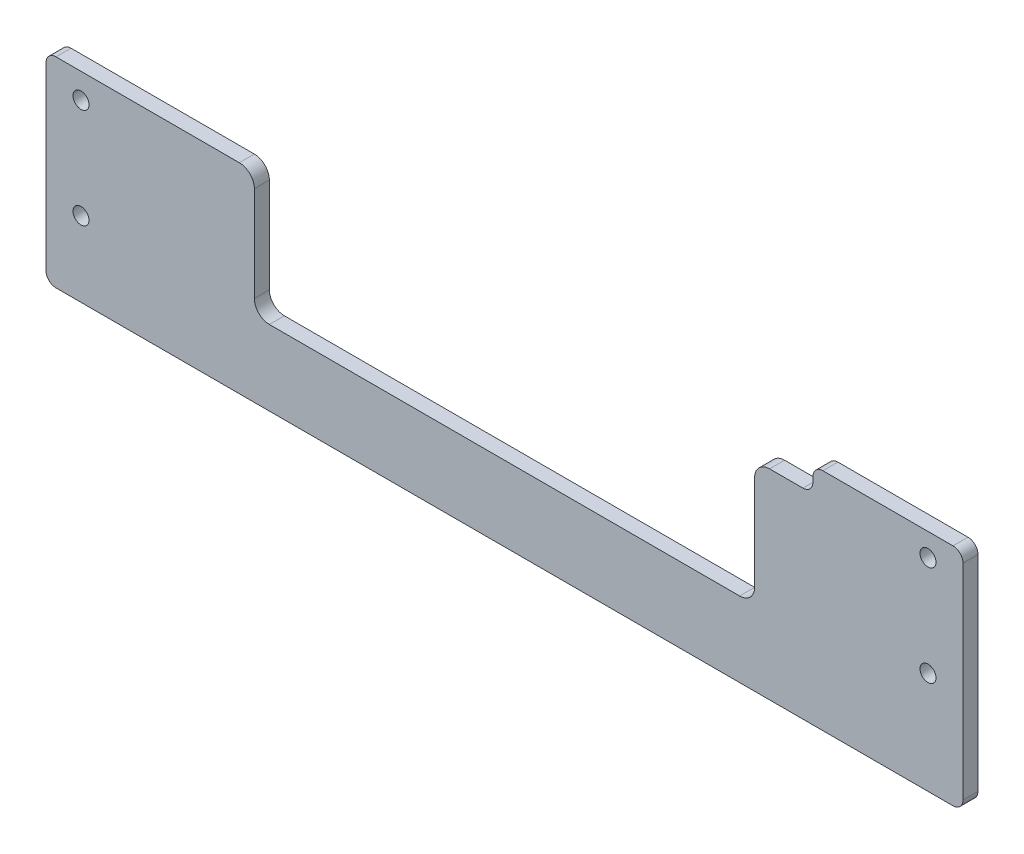
ISO-10303-21;
HEADER;
FILE_DESCRIPTION(('STEP AP214'),'2;1');
FILE_NAME('part.step','',(''),(''),'','','');
FILE_SCHEMA(('AUTOMOTIVE_DESIGN { 1 0 10303 214 1 1 1 1 }'));
ENDSEC;
DATA;
#1=APPLICATION_CONTEXT('core data for automotive mechanical design processes');
#2=APPLICATION_PROTOCOL_DEFINITION('international standard','automotive_design',2000,#1);
#3=PRODUCT_CONTEXT('',#1,'mechanical');
#4=PRODUCT('Part','Part','',(#3));
#5=PRODUCT_RELATED_PRODUCT_CATEGORY('part','',(#4));
#6=PRODUCT_DEFINITION_FORMATION('','',#4);
#7=PRODUCT_DEFINITION_CONTEXT('part definition',#1,'design');
#8=PRODUCT_DEFINITION('design','',#6,#7);
#9=PRODUCT_DEFINITION_SHAPE('','',#8);
#10=(LENGTH_UNIT() NAMED_UNIT(*) SI_UNIT(.MILLI.,.METRE.));
#11=(NAMED_UNIT(*) PLANE_ANGLE_UNIT() SI_UNIT($,.RADIAN.));
#12=(NAMED_UNIT(*) SI_UNIT($,.STERADIAN.) SOLID_ANGLE_UNIT());
#13=UNCERTAINTY_MEASURE_WITH_UNIT(LENGTH_MEASURE(1.E-05),#10,'distance_accuracy_value','');
#14=(GEOMETRIC_REPRESENTATION_CONTEXT(3) GLOBAL_UNCERTAINTY_ASSIGNED_CONTEXT((#13)) GLOBAL_UNIT_ASSIGNED_CONTEXT((#10,
#11,#12)) REPRESENTATION_CONTEXT('',''));
#15=CARTESIAN_POINT('',(0.,0.,0.));
#16=DIRECTION('',(0.,0.,1.));
#17=DIRECTION('',(1.,0.,0.));
#18=AXIS2_PLACEMENT_3D('',#15,#16,#17);
#19=CARTESIAN_POINT('',(0.,40.,3.));
#20=DIRECTION('',(0.,-1.,0.));
#21=DIRECTION('',(1.,0.,0.));
#22=AXIS2_PLACEMENT_3D('',#19,#20,#21);
#23=PLANE('',#22);
#24=DIRECTION('',(-1.,0.,0.));
#25=VECTOR('',#24,1.);
#26=CARTESIAN_POINT('',(0.,40.,0.));
#27=LINE('',#26,#25);
#28=CARTESIAN_POINT('',(151.3,40.,0.));
#29=VERTEX_POINT('',#28);
#30=CARTESIAN_POINT('',(144.65,40.,0.));
#31=VERTEX_POINT('',#30);
#32=EDGE_CURVE('E215',#29,#31,#27,.T.);
#33=ORIENTED_EDGE('',*,*,#32,.T.);
#34=DIRECTION('',(0.,0.,-1.));
#35=VECTOR('',#34,1.);
#36=CARTESIAN_POINT('',(144.65,40.,3.));
#37=LINE('',#36,#35);
#38=CARTESIAN_POINT('',(144.65,40.,3.));
#39=VERTEX_POINT('',#38);
#40=EDGE_CURVE('E377',#31,#39,#37,.F.);
#41=ORIENTED_EDGE('',*,*,#40,.T.);
#42=DIRECTION('',(-1.,0.,0.));
#43=VECTOR('',#42,1.);
#44=CARTESIAN_POINT('',(0.,40.,3.));
#45=LINE('',#44,#43);
#46=CARTESIAN_POINT('',(151.3,40.,3.));
#47=VERTEX_POINT('',#46);
#48=EDGE_CURVE('E219',#47,#39,#45,.T.);
#49=ORIENTED_EDGE('',*,*,#48,.F.);
#50=DIRECTION('',(0.,0.,-1.));
#51=VECTOR('',#50,1.);
#52=CARTESIAN_POINT('',(151.3,40.,0.));
#53=LINE('',#52,#51);
#54=EDGE_CURVE('E249',#47,#29,#53,.T.);
#55=ORIENTED_EDGE('',*,*,#54,.T.);
#56=EDGE_LOOP('',(#33,#41,#49,#55));
#57=FACE_BOUND('',#56,.T.);
#58=ADVANCED_FACE('F39',(#57),#23,.F.);
#59=CARTESIAN_POINT('',(0.,0.,3.));
#60=DIRECTION('',(1.,0.,0.));
#61=DIRECTION('',(0.,0.,-1.));
#62=AXIS2_PLACEMENT_3D('',#59,#60,#61);
#63=PLANE('',#62);
#64=DIRECTION('',(0.,-1.,0.));
#65=VECTOR('',#64,1.);
#66=CARTESIAN_POINT('',(0.,0.,0.));
#67=LINE('',#66,#65);
#68=CARTESIAN_POINT('',(0.,38.,0.));
#69=VERTEX_POINT('',#68);
#70=CARTESIAN_POINT('',(0.,2.,0.));
#71=VERTEX_POINT('',#70);
#72=EDGE_CURVE('E285',#69,#71,#67,.T.);
#73=ORIENTED_EDGE('',*,*,#72,.T.);
#74=DIRECTION('',(0.,0.,-1.));
#75=VECTOR('',#74,1.);
#76=CARTESIAN_POINT('',(0.,2.,3.));
#77=LINE('',#76,#75);
#78=CARTESIAN_POINT('',(0.,2.,3.));
#79=VERTEX_POINT('',#78);
#80=EDGE_CURVE('E260',#71,#79,#77,.F.);
#81=ORIENTED_EDGE('',*,*,#80,.T.);
#82=DIRECTION('',(0.,-1.,0.));
#83=VECTOR('',#82,1.);
#84=CARTESIAN_POINT('',(0.,0.,3.));
#85=LINE('',#84,#83);
#86=CARTESIAN_POINT('',(0.,38.,3.));
#87=VERTEX_POINT('',#86);
#88=EDGE_CURVE('E218',#87,#79,#85,.T.);
#89=ORIENTED_EDGE('',*,*,#88,.F.);
#90=DIRECTION('',(0.,0.,-1.));
#91=VECTOR('',#90,1.);
#92=CARTESIAN_POINT('',(0.,38.,3.));
#93=LINE('',#92,#91);
#94=EDGE_CURVE('E257',#87,#69,#93,.T.);
#95=ORIENTED_EDGE('',*,*,#94,.T.);
#96=EDGE_LOOP('',(#73,#81,#89,#95));
#97=FACE_BOUND('',#96,.T.);
#98=ADVANCED_FACE('F332',(#97),#63,.F.);
#99=CARTESIAN_POINT('',(0.,0.,3.));
#100=DIRECTION('',(0.,1.,0.));
#101=DIRECTION('',(0.,0.,1.));
#102=AXIS2_PLACEMENT_3D('',#99,#100,#101);
#103=PLANE('',#102);
#104=DIRECTION('',(1.,0.,0.));
#105=VECTOR('',#104,1.);
#106=CARTESIAN_POINT('',(0.,0.,0.));
#107=LINE('',#106,#105);
#108=CARTESIAN_POINT('',(2.,0.,0.));
#109=VERTEX_POINT('',#108);
#110=CARTESIAN_POINT('',(181.3,0.,0.));
#111=VERTEX_POINT('',#110);
#112=EDGE_CURVE('E211',#109,#111,#107,.T.);
#113=ORIENTED_EDGE('',*,*,#112,.T.);
#114=DIRECTION('',(0.,0.,-1.));
#115=VECTOR('',#114,1.);
#116=CARTESIAN_POINT('',(181.3,0.,3.));
#117=LINE('',#116,#115);
#118=CARTESIAN_POINT('',(181.3,0.,3.));
#119=VERTEX_POINT('',#118);
#120=EDGE_CURVE('E255',#111,#119,#117,.F.);
#121=ORIENTED_EDGE('',*,*,#120,.T.);
#122=DIRECTION('',(1.,0.,0.));
#123=VECTOR('',#122,1.);
#124=CARTESIAN_POINT('',(0.,0.,3.));
#125=LINE('',#124,#123);
#126=CARTESIAN_POINT('',(2.,0.,3.));
#127=VERTEX_POINT('',#126);
#128=EDGE_CURVE('E298',#127,#119,#125,.T.);
#129=ORIENTED_EDGE('',*,*,#128,.F.);
#130=DIRECTION('',(0.,0.,-1.));
#131=VECTOR('',#130,1.);
#132=CARTESIAN_POINT('',(2.,0.,3.));
#133=LINE('',#132,#131);
#134=EDGE_CURVE('E252',#127,#109,#133,.T.);
#135=ORIENTED_EDGE('',*,*,#134,.T.);
#136=EDGE_LOOP('',(#113,#121,#129,#135));
#137=FACE_BOUND('',#136,.T.);
#138=ADVANCED_FACE('F425',(#137),#103,.F.);
#139=CARTESIAN_POINT('',(183.3,40.,3.));
#140=DIRECTION('',(-1.,0.,0.));
#141=DIRECTION('',(0.,0.,1.));
#142=AXIS2_PLACEMENT_3D('',#139,#140,#141);
#143=PLANE('',#142);
#144=DIRECTION('',(0.,1.,0.));
#145=VECTOR('',#144,1.);
#146=CARTESIAN_POINT('',(183.3,40.,0.));
#147=LINE('',#146,#145);
#148=CARTESIAN_POINT('',(183.3,2.,0.));
#149=VERTEX_POINT('',#148);
#150=CARTESIAN_POINT('',(183.3,43.,0.));
#151=VERTEX_POINT('',#150);
#152=EDGE_CURVE('E206',#149,#151,#147,.T.);
#153=ORIENTED_EDGE('',*,*,#152,.T.);
#154=DIRECTION('',(0.,0.,-1.));
#155=VECTOR('',#154,1.);
#156=CARTESIAN_POINT('',(183.3,43.,3.));
#157=LINE('',#156,#155);
#158=CARTESIAN_POINT('',(183.3,43.,3.));
#159=VERTEX_POINT('',#158);
#160=EDGE_CURVE('E182',#151,#159,#157,.F.);
#161=ORIENTED_EDGE('',*,*,#160,.T.);
#162=DIRECTION('',(0.,1.,0.));
#163=VECTOR('',#162,1.);
#164=CARTESIAN_POINT('',(183.3,0.,3.));
#165=LINE('',#164,#163);
#166=CARTESIAN_POINT('',(183.3,2.,3.));
#167=VERTEX_POINT('',#166);
#168=EDGE_CURVE('E305',#167,#159,#165,.T.);
#169=ORIENTED_EDGE('',*,*,#168,.F.);
#170=DIRECTION('',(0.,0.,-1.));
#171=VECTOR('',#170,1.);
#172=CARTESIAN_POINT('',(183.3,2.,3.));
#173=LINE('',#172,#171);
#174=EDGE_CURVE('E187',#167,#149,#173,.T.);
#175=ORIENTED_EDGE('',*,*,#174,.T.);
#176=EDGE_LOOP('',(#153,#161,#169,#175));
#177=FACE_BOUND('',#176,.T.);
#178=ADVANCED_FACE('F440',(#177),#143,.F.);
#179=CARTESIAN_POINT('',(183.3,45.,3.));
#180=DIRECTION('',(0.,-1.,0.));
#181=DIRECTION('',(1.,0.,0.));
#182=AXIS2_PLACEMENT_3D('',#179,#180,#181);
#183=PLANE('',#182);
#184=DIRECTION('',(-1.,0.,0.));
#185=VECTOR('',#184,1.);
#186=CARTESIAN_POINT('',(183.3,45.,3.));
#187=LINE('',#186,#185);
#188=CARTESIAN_POINT('',(181.3,45.,3.));
#189=VERTEX_POINT('',#188);
#190=CARTESIAN_POINT('',(155.3,45.,3.));
#191=VERTEX_POINT('',#190);
#192=EDGE_CURVE('E197',#189,#191,#187,.T.);
#193=ORIENTED_EDGE('',*,*,#192,.F.);
#194=DIRECTION('',(0.,0.,-1.));
#195=VECTOR('',#194,1.);
#196=CARTESIAN_POINT('',(181.3,45.,3.));
#197=LINE('',#196,#195);
#198=CARTESIAN_POINT('',(181.3,45.,0.));
#199=VERTEX_POINT('',#198);
#200=EDGE_CURVE('E181',#189,#199,#197,.T.);
#201=ORIENTED_EDGE('',*,*,#200,.T.);
#202=DIRECTION('',(-1.,0.,0.));
#203=VECTOR('',#202,1.);
#204=CARTESIAN_POINT('',(183.3,45.,0.));
#205=LINE('',#204,#203);
#206=CARTESIAN_POINT('',(155.3,45.,0.));
#207=VERTEX_POINT('',#206);
#208=EDGE_CURVE('E194',#199,#207,#205,.T.);
#209=ORIENTED_EDGE('',*,*,#208,.T.);
#210=DIRECTION('',(0.,0.,-1.));
#211=VECTOR('',#210,1.);
#212=CARTESIAN_POINT('',(155.3,45.,3.));
#213=LINE('',#212,#211);
#214=EDGE_CURVE('E199',#207,#191,#213,.F.);
#215=ORIENTED_EDGE('',*,*,#214,.T.);
#216=EDGE_LOOP('',(#193,#201,#209,#215));
#217=FACE_BOUND('',#216,.T.);
#218=ADVANCED_FACE('F193',(#217),#183,.F.);
#219=CARTESIAN_POINT('',(153.3,40.,3.));
#220=DIRECTION('',(1.,0.,0.));
#221=DIRECTION('',(0.,0.,-1.));
#222=AXIS2_PLACEMENT_3D('',#219,#220,#221);
#223=PLANE('',#222);
#224=DIRECTION('',(0.,-1.,0.));
#225=VECTOR('',#224,1.);
#226=CARTESIAN_POINT('',(153.3,40.,3.));
#227=LINE('',#226,#225);
#228=CARTESIAN_POINT('',(153.3,43.,3.));
#229=VERTEX_POINT('',#228);
#230=CARTESIAN_POINT('',(153.3,42.,3.));
#231=VERTEX_POINT('',#230);
#232=EDGE_CURVE('E282',#229,#231,#227,.T.);
#233=ORIENTED_EDGE('',*,*,#232,.F.);
#234=DIRECTION('',(0.,0.,-1.));
#235=VECTOR('',#234,1.);
#236=CARTESIAN_POINT('',(153.3,43.,3.));
#237=LINE('',#236,#235);
#238=CARTESIAN_POINT('',(153.3,43.,0.));
#239=VERTEX_POINT('',#238);
#240=EDGE_CURVE('E243',#229,#239,#237,.T.);
#241=ORIENTED_EDGE('',*,*,#240,.T.);
#242=DIRECTION('',(0.,-1.,0.));
#243=VECTOR('',#242,1.);
#244=CARTESIAN_POINT('',(153.3,40.,0.));
#245=LINE('',#244,#243);
#246=CARTESIAN_POINT('',(153.3,42.,0.));
#247=VERTEX_POINT('',#246);
#248=EDGE_CURVE('E205',#239,#247,#245,.T.);
#249=ORIENTED_EDGE('',*,*,#248,.T.);
#250=DIRECTION('',(0.,0.,-1.));
#251=VECTOR('',#250,1.);
#252=CARTESIAN_POINT('',(153.3,42.,3.));
#253=LINE('',#252,#251);
#254=EDGE_CURVE('E241',#247,#231,#253,.F.);
#255=ORIENTED_EDGE('',*,*,#254,.T.);
#256=EDGE_LOOP('',(#233,#241,#249,#255));
#257=FACE_BOUND('',#256,.T.);
#258=ADVANCED_FACE('F430',(#257),#223,.F.);
#259=CARTESIAN_POINT('',(38.65,40.,3.));
#260=VERTEX_POINT('',#259);
#261=CARTESIAN_POINT('',(2.,40.,3.));
#262=VERTEX_POINT('',#261);
#263=EDGE_CURVE('E281',#260,#262,#45,.T.);
#264=ORIENTED_EDGE('',*,*,#263,.F.);
#265=DIRECTION('',(0.,0.,-1.));
#266=VECTOR('',#265,1.);
#267=CARTESIAN_POINT('',(38.65,40.,3.));
#268=LINE('',#267,#266);
#269=CARTESIAN_POINT('',(38.65,40.,0.));
#270=VERTEX_POINT('',#269);
#271=EDGE_CURVE('E267',#260,#270,#268,.T.);
#272=ORIENTED_EDGE('',*,*,#271,.T.);
#273=CARTESIAN_POINT('',(2.,40.,0.));
#274=VERTEX_POINT('',#273);
#275=EDGE_CURVE('E209',#270,#274,#27,.T.);
#276=ORIENTED_EDGE('',*,*,#275,.T.);
#277=DIRECTION('',(0.,0.,-1.));
#278=VECTOR('',#277,1.);
#279=CARTESIAN_POINT('',(2.,40.,3.));
#280=LINE('',#279,#278);
#281=EDGE_CURVE('E246',#274,#262,#280,.F.);
#282=ORIENTED_EDGE('',*,*,#281,.T.);
#283=EDGE_LOOP('',(#264,#272,#276,#282));
#284=FACE_BOUND('',#283,.T.);
#285=ADVANCED_FACE('F325',(#284),#23,.F.);
#286=CARTESIAN_POINT('',(0.,0.,3.));
#287=DIRECTION('',(0.,0.,-1.));
#288=DIRECTION('',(-1.,0.,0.));
#289=AXIS2_PLACEMENT_3D('',#286,#287,#288);
#290=PLANE('',#289);
#291=DIRECTION('',(0.,1.,0.));
#292=VECTOR('',#291,1.);
#293=CARTESIAN_POINT('',(41.65,0.,3.));
#294=LINE('',#293,#292);
#295=CARTESIAN_POINT('',(41.65,18.,3.));
#296=VERTEX_POINT('',#295);
#297=CARTESIAN_POINT('',(41.65,37.,3.));
#298=VERTEX_POINT('',#297);
#299=EDGE_CURVE('E646',#296,#298,#294,.T.);
#300=ORIENTED_EDGE('',*,*,#299,.T.);
#301=CARTESIAN_POINT('',(38.65,37.,3.));
#302=DIRECTION('',(0.,0.,-1.));
#303=DIRECTION('',(-1.,0.,0.));
#304=AXIS2_PLACEMENT_3D('',#301,#302,#303);
#305=CIRCLE('',#304,3.);
#306=EDGE_CURVE('E320',#298,#260,#305,.F.);
#307=ORIENTED_EDGE('',*,*,#306,.T.);
#308=ORIENTED_EDGE('',*,*,#263,.T.);
#309=CARTESIAN_POINT('',(2.,38.,3.));
#310=DIRECTION('',(0.,0.,-1.));
#311=DIRECTION('',(-1.,0.,0.));
#312=AXIS2_PLACEMENT_3D('',#309,#310,#311);
#313=CIRCLE('',#312,2.);
#314=EDGE_CURVE('E231',#262,#87,#313,.F.);
#315=ORIENTED_EDGE('',*,*,#314,.T.);
#316=ORIENTED_EDGE('',*,*,#88,.T.);
#317=CARTESIAN_POINT('',(2.,2.,3.));
#318=DIRECTION('',(0.,0.,-1.));
#319=DIRECTION('',(-1.,0.,0.));
#320=AXIS2_PLACEMENT_3D('',#317,#318,#319);
#321=CIRCLE('',#320,2.);
#322=EDGE_CURVE('E233',#79,#127,#321,.F.);
#323=ORIENTED_EDGE('',*,*,#322,.T.);
#324=ORIENTED_EDGE('',*,*,#128,.T.);
#325=CARTESIAN_POINT('',(181.3,2.,3.));
#326=DIRECTION('',(0.,0.,-1.));
#327=DIRECTION('',(-1.,0.,0.));
#328=AXIS2_PLACEMENT_3D('',#325,#326,#327);
#329=CIRCLE('',#328,2.);
#330=EDGE_CURVE('E235',#119,#167,#329,.F.);
#331=ORIENTED_EDGE('',*,*,#330,.T.);
#332=ORIENTED_EDGE('',*,*,#168,.T.);
#333=CARTESIAN_POINT('',(181.3,43.,3.));
#334=DIRECTION('',(0.,0.,-1.));
#335=DIRECTION('',(-1.,0.,0.));
#336=AXIS2_PLACEMENT_3D('',#333,#334,#335);
#337=CIRCLE('',#336,2.);
#338=EDGE_CURVE('E239',#159,#189,#337,.F.);
#339=ORIENTED_EDGE('',*,*,#338,.T.);
#340=ORIENTED_EDGE('',*,*,#192,.T.);
#341=CARTESIAN_POINT('',(155.3,43.,3.));
#342=DIRECTION('',(0.,0.,-1.));
#343=DIRECTION('',(-1.,0.,0.));
#344=AXIS2_PLACEMENT_3D('',#341,#342,#343);
#345=CIRCLE('',#344,2.);
#346=EDGE_CURVE('E237',#191,#229,#345,.F.);
#347=ORIENTED_EDGE('',*,*,#346,.T.);
#348=ORIENTED_EDGE('',*,*,#232,.T.);
#349=CARTESIAN_POINT('',(151.3,42.,3.));
#350=DIRECTION('',(0.,0.,-1.));
#351=DIRECTION('',(-1.,0.,0.));
#352=AXIS2_PLACEMENT_3D('',#349,#350,#351);
#353=CIRCLE('',#352,2.);
#354=EDGE_CURVE('E264',#231,#47,#353,.T.);
#355=ORIENTED_EDGE('',*,*,#354,.T.);
#356=ORIENTED_EDGE('',*,*,#48,.T.);
#357=CARTESIAN_POINT('',(144.65,37.,3.));
#358=DIRECTION('',(0.,0.,-1.));
#359=DIRECTION('',(-1.,0.,0.));
#360=AXIS2_PLACEMENT_3D('',#357,#358,#359);
#361=CIRCLE('',#360,3.);
#362=CARTESIAN_POINT('',(141.65,37.,3.));
#363=VERTEX_POINT('',#362);
#364=EDGE_CURVE('E385',#39,#363,#361,.F.);
#365=ORIENTED_EDGE('',*,*,#364,.T.);
#366=DIRECTION('',(0.,-1.,0.));
#367=VECTOR('',#366,1.);
#368=CARTESIAN_POINT('',(141.65,0.,3.));
#369=LINE('',#368,#367);
#370=CARTESIAN_POINT('',(141.65,18.,3.));
#371=VERTEX_POINT('',#370);
#372=EDGE_CURVE('E643',#363,#371,#369,.T.);
#373=ORIENTED_EDGE('',*,*,#372,.T.);
#374=CARTESIAN_POINT('',(138.65,18.,3.));
#375=DIRECTION('',(0.,0.,-1.));
#376=DIRECTION('',(-1.,0.,0.));
#377=AXIS2_PLACEMENT_3D('',#374,#375,#376);
#378=CIRCLE('',#377,3.);
#379=CARTESIAN_POINT('',(138.65,15.,3.));
#380=VERTEX_POINT('',#379);
#381=EDGE_CURVE('E12',#371,#380,#378,.T.);
#382=ORIENTED_EDGE('',*,*,#381,.T.);
#383=DIRECTION('',(-1.,0.,0.));
#384=VECTOR('',#383,1.);
#385=CARTESIAN_POINT('',(0.,15.,3.));
#386=LINE('',#385,#384);
#387=CARTESIAN_POINT('',(44.65,15.,3.));
#388=VERTEX_POINT('',#387);
#389=EDGE_CURVE('E404',#380,#388,#386,.T.);
#390=ORIENTED_EDGE('',*,*,#389,.T.);
#391=CARTESIAN_POINT('',(44.65,18.,3.));
#392=DIRECTION('',(0.,0.,-1.));
#393=DIRECTION('',(-1.,0.,0.));
#394=AXIS2_PLACEMENT_3D('',#391,#392,#393);
#395=CIRCLE('',#394,3.);
#396=EDGE_CURVE('E354',#388,#296,#395,.T.);
#397=ORIENTED_EDGE('',*,*,#396,.T.);
#398=EDGE_LOOP('',(#300,#307,#308,#315,#316,#323,#324,#331,#332,#339,#340,#347,#348,#355,#356,
#365,#373,#382,#390,#397));
#399=FACE_BOUND('',#398,.T.);
#400=CARTESIAN_POINT('',(176.3,40.44,3.));
#401=DIRECTION('',(0.,0.,-1.));
#402=DIRECTION('',(-1.,0.,0.));
#403=AXIS2_PLACEMENT_3D('',#400,#401,#402);
#404=CIRCLE('',#403,1.59999999999999);
#405=CARTESIAN_POINT('',(174.7,40.44,3.));
#406=VERTEX_POINT('',#405);
#407=EDGE_CURVE('E299',#406,#406,#404,.T.);
#408=ORIENTED_EDGE('',*,*,#407,.T.);
#409=EDGE_LOOP('',(#408));
#410=FACE_BOUND('',#409,.T.);
#411=CARTESIAN_POINT('',(176.3,20.44,3.));
#412=DIRECTION('',(0.,0.,-1.));
#413=DIRECTION('',(-1.,0.,0.));
#414=AXIS2_PLACEMENT_3D('',#411,#412,#413);
#415=CIRCLE('',#414,1.59999999999999);
#416=CARTESIAN_POINT('',(174.7,20.44,3.));
#417=VERTEX_POINT('',#416);
#418=EDGE_CURVE('E337',#417,#417,#415,.T.);
#419=ORIENTED_EDGE('',*,*,#418,.T.);
#420=EDGE_LOOP('',(#419));
#421=FACE_BOUND('',#420,.T.);
#422=CARTESIAN_POINT('',(7.,35.,3.));
#423=DIRECTION('',(0.,0.,-1.));
#424=DIRECTION('',(-1.,0.,0.));
#425=AXIS2_PLACEMENT_3D('',#422,#423,#424);
#426=CIRCLE('',#425,1.6);
#427=CARTESIAN_POINT('',(5.4,35.,3.));
#428=VERTEX_POINT('',#427);
#429=EDGE_CURVE('E340',#428,#428,#426,.T.);
#430=ORIENTED_EDGE('',*,*,#429,.T.);
#431=EDGE_LOOP('',(#430));
#432=FACE_BOUND('',#431,.T.);
#433=CARTESIAN_POINT('',(7.,15.,3.));
#434=DIRECTION('',(0.,0.,-1.));
#435=DIRECTION('',(-1.,0.,0.));
#436=AXIS2_PLACEMENT_3D('',#433,#434,#435);
#437=CIRCLE('',#436,1.6);
#438=CARTESIAN_POINT('',(5.4,15.,3.));
#439=VERTEX_POINT('',#438);
#440=EDGE_CURVE('E344',#439,#439,#437,.T.);
#441=ORIENTED_EDGE('',*,*,#440,.T.);
#442=EDGE_LOOP('',(#441));
#443=FACE_BOUND('',#442,.T.);
#444=ADVANCED_FACE('F315',(#399,#410,#421,#432,#443),#290,.F.);
#445=CARTESIAN_POINT('',(0.,0.,0.));
#446=DIRECTION('',(0.,0.,-1.));
#447=DIRECTION('',(-1.,0.,0.));
#448=AXIS2_PLACEMENT_3D('',#445,#446,#447);
#449=PLANE('',#448);
#450=ORIENTED_EDGE('',*,*,#275,.F.);
#451=CARTESIAN_POINT('',(38.65,37.,0.));
#452=DIRECTION('',(0.,0.,-1.));
#453=DIRECTION('',(-1.,0.,0.));
#454=AXIS2_PLACEMENT_3D('',#451,#452,#453);
#455=CIRCLE('',#454,3.);
#456=CARTESIAN_POINT('',(41.65,37.,0.));
#457=VERTEX_POINT('',#456);
#458=EDGE_CURVE('E392',#270,#457,#455,.T.);
#459=ORIENTED_EDGE('',*,*,#458,.T.);
#460=DIRECTION('',(0.,1.,0.));
#461=VECTOR('',#460,1.);
#462=CARTESIAN_POINT('',(41.65,40.,0.));
#463=LINE('',#462,#461);
#464=CARTESIAN_POINT('',(41.65,18.,0.));
#465=VERTEX_POINT('',#464);
#466=EDGE_CURVE('E398',#465,#457,#463,.T.);
#467=ORIENTED_EDGE('',*,*,#466,.F.);
#468=CARTESIAN_POINT('',(44.65,18.,0.));
#469=DIRECTION('',(0.,0.,-1.));
#470=DIRECTION('',(-1.,0.,0.));
#471=AXIS2_PLACEMENT_3D('',#468,#469,#470);
#472=CIRCLE('',#471,3.);
#473=CARTESIAN_POINT('',(44.65,15.,0.));
#474=VERTEX_POINT('',#473);
#475=EDGE_CURVE('E357',#465,#474,#472,.F.);
#476=ORIENTED_EDGE('',*,*,#475,.T.);
#477=DIRECTION('',(-1.,0.,0.));
#478=VECTOR('',#477,1.);
#479=CARTESIAN_POINT('',(141.65,15.,0.));
#480=LINE('',#479,#478);
#481=CARTESIAN_POINT('',(138.65,15.,0.));
#482=VERTEX_POINT('',#481);
#483=EDGE_CURVE('E363',#482,#474,#480,.T.);
#484=ORIENTED_EDGE('',*,*,#483,.F.);
#485=CARTESIAN_POINT('',(138.65,18.,0.));
#486=DIRECTION('',(0.,0.,-1.));
#487=DIRECTION('',(-1.,0.,0.));
#488=AXIS2_PLACEMENT_3D('',#485,#486,#487);
#489=CIRCLE('',#488,3.);
#490=CARTESIAN_POINT('',(141.65,18.,0.));
#491=VERTEX_POINT('',#490);
#492=EDGE_CURVE('E48',#482,#491,#489,.F.);
#493=ORIENTED_EDGE('',*,*,#492,.T.);
#494=DIRECTION('',(0.,-1.,0.));
#495=VECTOR('',#494,1.);
#496=CARTESIAN_POINT('',(141.65,40.,0.));
#497=LINE('',#496,#495);
#498=CARTESIAN_POINT('',(141.65,37.,0.));
#499=VERTEX_POINT('',#498);
#500=EDGE_CURVE('E362',#499,#491,#497,.T.);
#501=ORIENTED_EDGE('',*,*,#500,.F.);
#502=CARTESIAN_POINT('',(144.65,37.,0.));
#503=DIRECTION('',(0.,0.,-1.));
#504=DIRECTION('',(-1.,0.,0.));
#505=AXIS2_PLACEMENT_3D('',#502,#503,#504);
#506=CIRCLE('',#505,3.);
#507=EDGE_CURVE('E393',#499,#31,#506,.T.);
#508=ORIENTED_EDGE('',*,*,#507,.T.);
#509=ORIENTED_EDGE('',*,*,#32,.F.);
#510=CARTESIAN_POINT('',(151.3,42.,0.));
#511=DIRECTION('',(0.,0.,-1.));
#512=DIRECTION('',(-1.,0.,0.));
#513=AXIS2_PLACEMENT_3D('',#510,#511,#512);
#514=CIRCLE('',#513,2.);
#515=EDGE_CURVE('E262',#29,#247,#514,.F.);
#516=ORIENTED_EDGE('',*,*,#515,.T.);
#517=ORIENTED_EDGE('',*,*,#248,.F.);
#518=CARTESIAN_POINT('',(155.3,43.,0.));
#519=DIRECTION('',(0.,0.,-1.));
#520=DIRECTION('',(-1.,0.,0.));
#521=AXIS2_PLACEMENT_3D('',#518,#519,#520);
#522=CIRCLE('',#521,2.);
#523=EDGE_CURVE('E188',#239,#207,#522,.T.);
#524=ORIENTED_EDGE('',*,*,#523,.T.);
#525=ORIENTED_EDGE('',*,*,#208,.F.);
#526=CARTESIAN_POINT('',(181.3,43.,0.));
#527=DIRECTION('',(0.,0.,-1.));
#528=DIRECTION('',(-1.,0.,0.));
#529=AXIS2_PLACEMENT_3D('',#526,#527,#528);
#530=CIRCLE('',#529,2.);
#531=EDGE_CURVE('E177',#199,#151,#530,.T.);
#532=ORIENTED_EDGE('',*,*,#531,.T.);
#533=ORIENTED_EDGE('',*,*,#152,.F.);
#534=CARTESIAN_POINT('',(181.3,2.,0.));
#535=DIRECTION('',(0.,0.,-1.));
#536=DIRECTION('',(-1.,0.,0.));
#537=AXIS2_PLACEMENT_3D('',#534,#535,#536);
#538=CIRCLE('',#537,2.);
#539=EDGE_CURVE('E225',#149,#111,#538,.T.);
#540=ORIENTED_EDGE('',*,*,#539,.T.);
#541=ORIENTED_EDGE('',*,*,#112,.F.);
#542=CARTESIAN_POINT('',(2.,2.,0.));
#543=DIRECTION('',(0.,0.,-1.));
#544=DIRECTION('',(-1.,0.,0.));
#545=AXIS2_PLACEMENT_3D('',#542,#543,#544);
#546=CIRCLE('',#545,2.);
#547=EDGE_CURVE('E223',#109,#71,#546,.T.);
#548=ORIENTED_EDGE('',*,*,#547,.T.);
#549=ORIENTED_EDGE('',*,*,#72,.F.);
#550=CARTESIAN_POINT('',(2.,38.,0.));
#551=DIRECTION('',(0.,0.,-1.));
#552=DIRECTION('',(-1.,0.,0.));
#553=AXIS2_PLACEMENT_3D('',#550,#551,#552);
#554=CIRCLE('',#553,2.);
#555=EDGE_CURVE('E198',#69,#274,#554,.T.);
#556=ORIENTED_EDGE('',*,*,#555,.T.);
#557=EDGE_LOOP('',(#450,#459,#467,#476,#484,#493,#501,#508,#509,#516,#517,#524,#525,#532,#533,
#540,#541,#548,#549,#556));
#558=FACE_BOUND('',#557,.T.);
#559=CARTESIAN_POINT('',(176.3,40.44,0.));
#560=DIRECTION('',(0.,0.,-1.));
#561=DIRECTION('',(-1.,0.,0.));
#562=AXIS2_PLACEMENT_3D('',#559,#560,#561);
#563=CIRCLE('',#562,1.59999999999999);
#564=CARTESIAN_POINT('',(174.7,40.44,0.));
#565=VERTEX_POINT('',#564);
#566=EDGE_CURVE('E652',#565,#565,#563,.T.);
#567=ORIENTED_EDGE('',*,*,#566,.F.);
#568=EDGE_LOOP('',(#567));
#569=FACE_BOUND('',#568,.T.);
#570=CARTESIAN_POINT('',(176.3,20.44,0.));
#571=DIRECTION('',(0.,0.,-1.));
#572=DIRECTION('',(-1.,0.,0.));
#573=AXIS2_PLACEMENT_3D('',#570,#571,#572);
#574=CIRCLE('',#573,1.59999999999999);
#575=CARTESIAN_POINT('',(174.7,20.44,0.));
#576=VERTEX_POINT('',#575);
#577=EDGE_CURVE('E655',#576,#576,#574,.T.);
#578=ORIENTED_EDGE('',*,*,#577,.F.);
#579=EDGE_LOOP('',(#578));
#580=FACE_BOUND('',#579,.T.);
#581=CARTESIAN_POINT('',(7.,35.,0.));
#582=DIRECTION('',(0.,0.,-1.));
#583=DIRECTION('',(-1.,0.,0.));
#584=AXIS2_PLACEMENT_3D('',#581,#582,#583);
#585=CIRCLE('',#584,1.6);
#586=CARTESIAN_POINT('',(5.4,35.,0.));
#587=VERTEX_POINT('',#586);
#588=EDGE_CURVE('E647',#587,#587,#585,.T.);
#589=ORIENTED_EDGE('',*,*,#588,.F.);
#590=EDGE_LOOP('',(#589));
#591=FACE_BOUND('',#590,.T.);
#592=CARTESIAN_POINT('',(7.,15.,0.));
#593=DIRECTION('',(0.,0.,-1.));
#594=DIRECTION('',(-1.,0.,0.));
#595=AXIS2_PLACEMENT_3D('',#592,#593,#594);
#596=CIRCLE('',#595,1.6);
#597=CARTESIAN_POINT('',(5.4,15.,0.));
#598=VERTEX_POINT('',#597);
#599=EDGE_CURVE('E645',#598,#598,#596,.T.);
#600=ORIENTED_EDGE('',*,*,#599,.F.);
#601=EDGE_LOOP('',(#600));
#602=FACE_BOUND('',#601,.T.);
#603=ADVANCED_FACE('F202',(#558,#569,#580,#591,#602),#449,.T.);
#604=CARTESIAN_POINT('',(181.3,43.,3.));
#605=DIRECTION('',(0.,0.,-1.));
#606=DIRECTION('',(-1.,0.,0.));
#607=AXIS2_PLACEMENT_3D('',#604,#605,#606);
#608=CYLINDRICAL_SURFACE('',#607,2.);
#609=ORIENTED_EDGE('',*,*,#338,.F.);
#610=ORIENTED_EDGE('',*,*,#160,.F.);
#611=ORIENTED_EDGE('',*,*,#531,.F.);
#612=ORIENTED_EDGE('',*,*,#200,.F.);
#613=EDGE_LOOP('',(#609,#610,#611,#612));
#614=FACE_BOUND('',#613,.T.);
#615=ADVANCED_FACE('F180',(#614),#608,.T.);
#616=CARTESIAN_POINT('',(155.3,43.,3.));
#617=DIRECTION('',(0.,0.,-1.));
#618=DIRECTION('',(-1.,0.,0.));
#619=AXIS2_PLACEMENT_3D('',#616,#617,#618);
#620=CYLINDRICAL_SURFACE('',#619,2.);
#621=ORIENTED_EDGE('',*,*,#346,.F.);
#622=ORIENTED_EDGE('',*,*,#214,.F.);
#623=ORIENTED_EDGE('',*,*,#523,.F.);
#624=ORIENTED_EDGE('',*,*,#240,.F.);
#625=EDGE_LOOP('',(#621,#622,#623,#624));
#626=FACE_BOUND('',#625,.T.);
#627=ADVANCED_FACE('F451',(#626),#620,.T.);
#628=CARTESIAN_POINT('',(151.3,42.,3.));
#629=DIRECTION('',(0.,0.,1.));
#630=DIRECTION('',(1.,0.,0.));
#631=AXIS2_PLACEMENT_3D('',#628,#629,#630);
#632=CYLINDRICAL_SURFACE('',#631,2.);
#633=ORIENTED_EDGE('',*,*,#354,.F.);
#634=ORIENTED_EDGE('',*,*,#254,.F.);
#635=ORIENTED_EDGE('',*,*,#515,.F.);
#636=ORIENTED_EDGE('',*,*,#54,.F.);
#637=EDGE_LOOP('',(#633,#634,#635,#636));
#638=FACE_BOUND('',#637,.T.);
#639=ADVANCED_FACE('F454',(#638),#632,.F.);
#640=CARTESIAN_POINT('',(181.3,2.,3.));
#641=DIRECTION('',(0.,0.,-1.));
#642=DIRECTION('',(-1.,0.,0.));
#643=AXIS2_PLACEMENT_3D('',#640,#641,#642);
#644=CYLINDRICAL_SURFACE('',#643,2.);
#645=ORIENTED_EDGE('',*,*,#330,.F.);
#646=ORIENTED_EDGE('',*,*,#120,.F.);
#647=ORIENTED_EDGE('',*,*,#539,.F.);
#648=ORIENTED_EDGE('',*,*,#174,.F.);
#649=EDGE_LOOP('',(#645,#646,#647,#648));
#650=FACE_BOUND('',#649,.T.);
#651=ADVANCED_FACE('F458',(#650),#644,.T.);
#652=CARTESIAN_POINT('',(2.,2.,3.));
#653=DIRECTION('',(0.,0.,-1.));
#654=DIRECTION('',(-1.,0.,0.));
#655=AXIS2_PLACEMENT_3D('',#652,#653,#654);
#656=CYLINDRICAL_SURFACE('',#655,2.);
#657=ORIENTED_EDGE('',*,*,#322,.F.);
#658=ORIENTED_EDGE('',*,*,#80,.F.);
#659=ORIENTED_EDGE('',*,*,#547,.F.);
#660=ORIENTED_EDGE('',*,*,#134,.F.);
#661=EDGE_LOOP('',(#657,#658,#659,#660));
#662=FACE_BOUND('',#661,.T.);
#663=ADVANCED_FACE('F462',(#662),#656,.T.);
#664=CARTESIAN_POINT('',(2.,38.,3.));
#665=DIRECTION('',(0.,0.,-1.));
#666=DIRECTION('',(-1.,0.,0.));
#667=AXIS2_PLACEMENT_3D('',#664,#665,#666);
#668=CYLINDRICAL_SURFACE('',#667,2.);
#669=ORIENTED_EDGE('',*,*,#314,.F.);
#670=ORIENTED_EDGE('',*,*,#281,.F.);
#671=ORIENTED_EDGE('',*,*,#555,.F.);
#672=ORIENTED_EDGE('',*,*,#94,.F.);
#673=EDGE_LOOP('',(#669,#670,#671,#672));
#674=FACE_BOUND('',#673,.T.);
#675=ADVANCED_FACE('F328',(#674),#668,.T.);
#676=CARTESIAN_POINT('',(7.,15.,14.));
#677=DIRECTION('',(0.,0.,-1.));
#678=DIRECTION('',(-1.,0.,0.));
#679=AXIS2_PLACEMENT_3D('',#676,#677,#678);
#680=CYLINDRICAL_SURFACE('',#679,1.6);
#681=ORIENTED_EDGE('',*,*,#599,.T.);
#682=EDGE_LOOP('',(#681));
#683=FACE_BOUND('',#682,.T.);
#684=ORIENTED_EDGE('',*,*,#440,.F.);
#685=EDGE_LOOP('',(#684));
#686=FACE_BOUND('',#685,.T.);
#687=ADVANCED_FACE('F467',(#683,#686),#680,.F.);
#688=CARTESIAN_POINT('',(7.,35.,14.));
#689=DIRECTION('',(0.,0.,-1.));
#690=DIRECTION('',(-1.,0.,0.));
#691=AXIS2_PLACEMENT_3D('',#688,#689,#690);
#692=CYLINDRICAL_SURFACE('',#691,1.6);
#693=ORIENTED_EDGE('',*,*,#588,.T.);
#694=EDGE_LOOP('',(#693));
#695=FACE_BOUND('',#694,.T.);
#696=ORIENTED_EDGE('',*,*,#429,.F.);
#697=EDGE_LOOP('',(#696));
#698=FACE_BOUND('',#697,.T.);
#699=ADVANCED_FACE('F471',(#695,#698),#692,.F.);
#700=CARTESIAN_POINT('',(176.3,20.44,14.));
#701=DIRECTION('',(0.,0.,-1.));
#702=DIRECTION('',(-1.,0.,0.));
#703=AXIS2_PLACEMENT_3D('',#700,#701,#702);
#704=CYLINDRICAL_SURFACE('',#703,1.59999999999999);
#705=ORIENTED_EDGE('',*,*,#577,.T.);
#706=EDGE_LOOP('',(#705));
#707=FACE_BOUND('',#706,.T.);
#708=ORIENTED_EDGE('',*,*,#418,.F.);
#709=EDGE_LOOP('',(#708));
#710=FACE_BOUND('',#709,.T.);
#711=ADVANCED_FACE('F477',(#707,#710),#704,.F.);
#712=CARTESIAN_POINT('',(176.3,40.44,14.));
#713=DIRECTION('',(0.,0.,-1.));
#714=DIRECTION('',(-1.,0.,0.));
#715=AXIS2_PLACEMENT_3D('',#712,#713,#714);
#716=CYLINDRICAL_SURFACE('',#715,1.59999999999999);
#717=ORIENTED_EDGE('',*,*,#566,.T.);
#718=EDGE_LOOP('',(#717));
#719=FACE_BOUND('',#718,.T.);
#720=ORIENTED_EDGE('',*,*,#407,.F.);
#721=EDGE_LOOP('',(#720));
#722=FACE_BOUND('',#721,.T.);
#723=ADVANCED_FACE('F532',(#719,#722),#716,.F.);
#724=CARTESIAN_POINT('',(141.65,40.,14.));
#725=DIRECTION('',(1.,0.,0.));
#726=DIRECTION('',(0.,0.,-1.));
#727=AXIS2_PLACEMENT_3D('',#724,#725,#726);
#728=PLANE('',#727);
#729=ORIENTED_EDGE('',*,*,#500,.T.);
#730=DIRECTION('',(0.,0.,-1.));
#731=VECTOR('',#730,1.);
#732=CARTESIAN_POINT('',(141.65,18.,3.));
#733=LINE('',#732,#731);
#734=EDGE_CURVE('E372',#491,#371,#733,.F.);
#735=ORIENTED_EDGE('',*,*,#734,.T.);
#736=ORIENTED_EDGE('',*,*,#372,.F.);
#737=DIRECTION('',(0.,0.,-1.));
#738=VECTOR('',#737,1.);
#739=CARTESIAN_POINT('',(141.65,37.,14.));
#740=LINE('',#739,#738);
#741=EDGE_CURVE('E374',#363,#499,#740,.T.);
#742=ORIENTED_EDGE('',*,*,#741,.T.);
#743=EDGE_LOOP('',(#729,#735,#736,#742));
#744=FACE_BOUND('',#743,.T.);
#745=ADVANCED_FACE('F370',(#744),#728,.F.);
#746=CARTESIAN_POINT('',(41.65,40.,14.));
#747=DIRECTION('',(-1.,0.,0.));
#748=DIRECTION('',(0.,0.,1.));
#749=AXIS2_PLACEMENT_3D('',#746,#747,#748);
#750=PLANE('',#749);
#751=ORIENTED_EDGE('',*,*,#466,.T.);
#752=DIRECTION('',(0.,0.,-1.));
#753=VECTOR('',#752,1.);
#754=CARTESIAN_POINT('',(41.65,37.,14.));
#755=LINE('',#754,#753);
#756=EDGE_CURVE('E387',#457,#298,#755,.F.);
#757=ORIENTED_EDGE('',*,*,#756,.T.);
#758=ORIENTED_EDGE('',*,*,#299,.F.);
#759=DIRECTION('',(0.,0.,-1.));
#760=VECTOR('',#759,1.);
#761=CARTESIAN_POINT('',(41.65,18.,0.));
#762=LINE('',#761,#760);
#763=EDGE_CURVE('E389',#296,#465,#762,.T.);
#764=ORIENTED_EDGE('',*,*,#763,.T.);
#765=EDGE_LOOP('',(#751,#757,#758,#764));
#766=FACE_BOUND('',#765,.T.);
#767=ADVANCED_FACE('F401',(#766),#750,.F.);
#768=CARTESIAN_POINT('',(141.65,15.,14.));
#769=DIRECTION('',(0.,-1.,0.));
#770=DIRECTION('',(1.,0.,0.));
#771=AXIS2_PLACEMENT_3D('',#768,#769,#770);
#772=PLANE('',#771);
#773=ORIENTED_EDGE('',*,*,#483,.T.);
#774=DIRECTION('',(0.,0.,-1.));
#775=VECTOR('',#774,1.);
#776=CARTESIAN_POINT('',(44.65,15.,3.));
#777=LINE('',#776,#775);
#778=EDGE_CURVE('E55',#474,#388,#777,.F.);
#779=ORIENTED_EDGE('',*,*,#778,.T.);
#780=ORIENTED_EDGE('',*,*,#389,.F.);
#781=DIRECTION('',(0.,0.,-1.));
#782=VECTOR('',#781,1.);
#783=CARTESIAN_POINT('',(138.65,15.,0.));
#784=LINE('',#783,#782);
#785=EDGE_CURVE('E382',#380,#482,#784,.T.);
#786=ORIENTED_EDGE('',*,*,#785,.T.);
#787=EDGE_LOOP('',(#773,#779,#780,#786));
#788=FACE_BOUND('',#787,.T.);
#789=ADVANCED_FACE('F409',(#788),#772,.F.);
#790=CARTESIAN_POINT('',(38.65,37.,3.));
#791=DIRECTION('',(0.,0.,-1.));
#792=DIRECTION('',(-1.,0.,0.));
#793=AXIS2_PLACEMENT_3D('',#790,#791,#792);
#794=CYLINDRICAL_SURFACE('',#793,3.);
#795=ORIENTED_EDGE('',*,*,#306,.F.);
#796=ORIENTED_EDGE('',*,*,#756,.F.);
#797=ORIENTED_EDGE('',*,*,#458,.F.);
#798=ORIENTED_EDGE('',*,*,#271,.F.);
#799=EDGE_LOOP('',(#795,#796,#797,#798));
#800=FACE_BOUND('',#799,.T.);
#801=ADVANCED_FACE('F406',(#800),#794,.T.);
#802=CARTESIAN_POINT('',(44.65,18.,14.));
#803=DIRECTION('',(0.,0.,1.));
#804=DIRECTION('',(1.,0.,0.));
#805=AXIS2_PLACEMENT_3D('',#802,#803,#804);
#806=CYLINDRICAL_SURFACE('',#805,3.);
#807=ORIENTED_EDGE('',*,*,#396,.F.);
#808=ORIENTED_EDGE('',*,*,#778,.F.);
#809=ORIENTED_EDGE('',*,*,#475,.F.);
#810=ORIENTED_EDGE('',*,*,#763,.F.);
#811=EDGE_LOOP('',(#807,#808,#809,#810));
#812=FACE_BOUND('',#811,.T.);
#813=ADVANCED_FACE('F408',(#812),#806,.F.);
#814=CARTESIAN_POINT('',(138.65,18.,14.));
#815=DIRECTION('',(0.,0.,1.));
#816=DIRECTION('',(1.,0.,0.));
#817=AXIS2_PLACEMENT_3D('',#814,#815,#816);
#818=CYLINDRICAL_SURFACE('',#817,3.);
#819=ORIENTED_EDGE('',*,*,#381,.F.);
#820=ORIENTED_EDGE('',*,*,#734,.F.);
#821=ORIENTED_EDGE('',*,*,#492,.F.);
#822=ORIENTED_EDGE('',*,*,#785,.F.);
#823=EDGE_LOOP('',(#819,#820,#821,#822));
#824=FACE_BOUND('',#823,.T.);
#825=ADVANCED_FACE('F376',(#824),#818,.F.);
#826=CARTESIAN_POINT('',(144.65,37.,14.));
#827=DIRECTION('',(0.,0.,-1.));
#828=DIRECTION('',(-1.,0.,0.));
#829=AXIS2_PLACEMENT_3D('',#826,#827,#828);
#830=CYLINDRICAL_SURFACE('',#829,3.);
#831=ORIENTED_EDGE('',*,*,#364,.F.);
#832=ORIENTED_EDGE('',*,*,#40,.F.);
#833=ORIENTED_EDGE('',*,*,#507,.F.);
#834=ORIENTED_EDGE('',*,*,#741,.F.);
#835=EDGE_LOOP('',(#831,#832,#833,#834));
#836=FACE_BOUND('',#835,.T.);
#837=ADVANCED_FACE('F41',(#836),#830,.T.);
#838=CLOSED_SHELL('',(#58,#98,#138,#178,#218,#258,#285,#444,#603,#615,#627,#639,#651,#663,#675,
#687,#699,#711,#723,#745,#767,#789,#801,#813,#825,#837));
#839=MANIFOLD_SOLID_BREP('B2',#838);
#840=ADVANCED_BREP_SHAPE_REPRESENTATION('',(#18,#839),#14);
#841=SHAPE_DEFINITION_REPRESENTATION(#9,#840);
ENDSEC;
END-ISO-10303-21;
